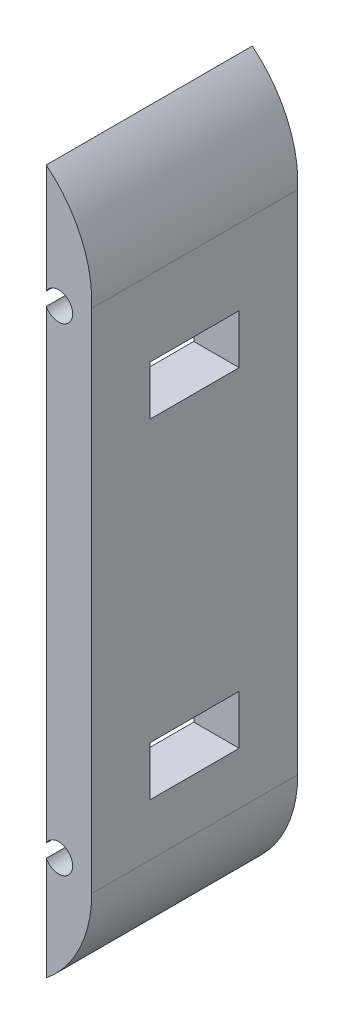
ISO-10303-21;
HEADER;
FILE_DESCRIPTION(('STEP AP214'),'2;1');
FILE_NAME('part.step','',(''),(''),'','','');
FILE_SCHEMA(('AUTOMOTIVE_DESIGN { 1 0 10303 214 1 1 1 1 }'));
ENDSEC;
DATA;
#1=APPLICATION_CONTEXT('core data for automotive mechanical design processes');
#2=APPLICATION_PROTOCOL_DEFINITION('international standard','automotive_design',2000,#1);
#3=PRODUCT_CONTEXT('',#1,'mechanical');
#4=PRODUCT('Part','Part','',(#3));
#5=PRODUCT_RELATED_PRODUCT_CATEGORY('part','',(#4));
#6=PRODUCT_DEFINITION_FORMATION('','',#4);
#7=PRODUCT_DEFINITION_CONTEXT('part definition',#1,'design');
#8=PRODUCT_DEFINITION('design','',#6,#7);
#9=PRODUCT_DEFINITION_SHAPE('','',#8);
#10=(LENGTH_UNIT() NAMED_UNIT(*) SI_UNIT(.MILLI.,.METRE.));
#11=(NAMED_UNIT(*) PLANE_ANGLE_UNIT() SI_UNIT($,.RADIAN.));
#12=(NAMED_UNIT(*) SI_UNIT($,.STERADIAN.) SOLID_ANGLE_UNIT());
#13=UNCERTAINTY_MEASURE_WITH_UNIT(LENGTH_MEASURE(1.E-05),#10,'distance_accuracy_value','');
#14=(GEOMETRIC_REPRESENTATION_CONTEXT(3) GLOBAL_UNCERTAINTY_ASSIGNED_CONTEXT((#13)) GLOBAL_UNIT_ASSIGNED_CONTEXT((#10,
#11,#12)) REPRESENTATION_CONTEXT('',''));
#15=CARTESIAN_POINT('',(0.,0.,0.));
#16=DIRECTION('',(0.,0.,1.));
#17=DIRECTION('',(1.,0.,0.));
#18=AXIS2_PLACEMENT_3D('',#15,#16,#17);
#19=CARTESIAN_POINT('',(-1.01526099399118,-27.0409833911618,25.));
#20=DIRECTION('',(0.,0.,-1.));
#21=DIRECTION('',(-1.,0.,0.));
#22=AXIS2_PLACEMENT_3D('',#19,#20,#21);
#23=CYLINDRICAL_SURFACE('',#22,1.70000000000002);
#24=CARTESIAN_POINT('',(-1.01526099399118,-27.0409833911618,0.));
#25=DIRECTION('',(0.,0.,-1.));
#26=DIRECTION('',(1.,0.,0.));
#27=AXIS2_PLACEMENT_3D('',#24,#25,#26);
#28=CIRCLE('',#27,1.70000000000002);
#29=CARTESIAN_POINT('',(-2.51526099399118,-26.2409833911617,0.));
#30=VERTEX_POINT('',#29);
#31=CARTESIAN_POINT('',(-2.51526099399118,-27.8409833911618,0.));
#32=VERTEX_POINT('',#31);
#33=EDGE_CURVE('E182',#30,#32,#28,.T.);
#34=ORIENTED_EDGE('',*,*,#33,.T.);
#35=DIRECTION('',(0.,0.,-1.));
#36=VECTOR('',#35,1.);
#37=CARTESIAN_POINT('',(-2.51526099399118,-27.8409833911618,25.));
#38=LINE('',#37,#36);
#39=CARTESIAN_POINT('',(-2.51526099399118,-27.8409833911618,25.));
#40=VERTEX_POINT('',#39);
#41=EDGE_CURVE('E258',#40,#32,#38,.T.);
#42=ORIENTED_EDGE('',*,*,#41,.F.);
#43=CARTESIAN_POINT('',(-1.01526099399118,-27.0409833911618,25.));
#44=DIRECTION('',(0.,0.,-1.));
#45=DIRECTION('',(1.,0.,0.));
#46=AXIS2_PLACEMENT_3D('',#43,#44,#45);
#47=CIRCLE('',#46,1.70000000000002);
#48=CARTESIAN_POINT('',(-2.51526099399118,-26.2409833911617,25.));
#49=VERTEX_POINT('',#48);
#50=EDGE_CURVE('E203',#49,#40,#47,.T.);
#51=ORIENTED_EDGE('',*,*,#50,.F.);
#52=DIRECTION('',(0.,0.,-1.));
#53=VECTOR('',#52,1.);
#54=CARTESIAN_POINT('',(-2.51526099399118,-26.2409833911617,25.));
#55=LINE('',#54,#53);
#56=EDGE_CURVE('E221',#49,#30,#55,.T.);
#57=ORIENTED_EDGE('',*,*,#56,.T.);
#58=EDGE_LOOP('',(#34,#42,#51,#57));
#59=FACE_BOUND('',#58,.T.);
#60=ADVANCED_FACE('F39',(#59),#23,.F.);
#61=CARTESIAN_POINT('',(-2.51526099399118,-27.8409833911618,25.));
#62=DIRECTION('',(1.,0.,0.));
#63=DIRECTION('',(0.,1.,0.));
#64=AXIS2_PLACEMENT_3D('',#61,#62,#63);
#65=PLANE('',#64);
#66=DIRECTION('',(0.,-1.,0.));
#67=VECTOR('',#66,1.);
#68=CARTESIAN_POINT('',(-2.51526099399118,-27.8409833911618,0.));
#69=LINE('',#68,#67);
#70=CARTESIAN_POINT('',(-2.51526099399119,-40.4206594472041,0.));
#71=VERTEX_POINT('',#70);
#72=EDGE_CURVE('E224',#32,#71,#69,.T.);
#73=ORIENTED_EDGE('',*,*,#72,.T.);
#74=DIRECTION('',(0.,0.,-1.));
#75=VECTOR('',#74,1.);
#76=CARTESIAN_POINT('',(-2.51526099399119,-40.4206594472041,25.));
#77=LINE('',#76,#75);
#78=CARTESIAN_POINT('',(-2.51526099399119,-40.4206594472041,25.));
#79=VERTEX_POINT('',#78);
#80=EDGE_CURVE('E255',#79,#71,#77,.T.);
#81=ORIENTED_EDGE('',*,*,#80,.F.);
#82=DIRECTION('',(0.,-1.,0.));
#83=VECTOR('',#82,1.);
#84=CARTESIAN_POINT('',(-2.51526099399118,-27.8409833911618,25.));
#85=LINE('',#84,#83);
#86=EDGE_CURVE('E206',#40,#79,#85,.T.);
#87=ORIENTED_EDGE('',*,*,#86,.F.);
#88=ORIENTED_EDGE('',*,*,#41,.T.);
#89=EDGE_LOOP('',(#73,#81,#87,#88));
#90=FACE_BOUND('',#89,.T.);
#91=ADVANCED_FACE('F297',(#90),#65,.F.);
#92=CARTESIAN_POINT('',(-12.,-28.8,25.));
#93=DIRECTION('',(0.,0.,-1.));
#94=DIRECTION('',(-1.,0.,0.));
#95=AXIS2_PLACEMENT_3D('',#92,#93,#94);
#96=CYLINDRICAL_SURFACE('',#95,15.);
#97=CARTESIAN_POINT('',(-12.,-28.8,0.));
#98=DIRECTION('',(0.,0.,1.));
#99=DIRECTION('',(-1.,0.,0.));
#100=AXIS2_PLACEMENT_3D('',#97,#98,#99);
#101=CIRCLE('',#100,15.);
#102=CARTESIAN_POINT('',(3.,-28.8,0.));
#103=VERTEX_POINT('',#102);
#104=EDGE_CURVE('E226',#71,#103,#101,.T.);
#105=ORIENTED_EDGE('',*,*,#104,.T.);
#106=DIRECTION('',(0.,0.,-1.));
#107=VECTOR('',#106,1.);
#108=CARTESIAN_POINT('',(3.,-28.8,25.));
#109=LINE('',#108,#107);
#110=CARTESIAN_POINT('',(3.,-28.8,25.));
#111=VERTEX_POINT('',#110);
#112=EDGE_CURVE('E252',#111,#103,#109,.T.);
#113=ORIENTED_EDGE('',*,*,#112,.F.);
#114=CARTESIAN_POINT('',(-12.,-28.8,25.));
#115=DIRECTION('',(0.,0.,1.));
#116=DIRECTION('',(-1.,0.,0.));
#117=AXIS2_PLACEMENT_3D('',#114,#115,#116);
#118=CIRCLE('',#117,15.);
#119=EDGE_CURVE('E209',#79,#111,#118,.T.);
#120=ORIENTED_EDGE('',*,*,#119,.F.);
#121=ORIENTED_EDGE('',*,*,#80,.T.);
#122=EDGE_LOOP('',(#105,#113,#120,#121));
#123=FACE_BOUND('',#122,.T.);
#124=ADVANCED_FACE('F302',(#123),#96,.T.);
#125=CARTESIAN_POINT('',(3.,-28.8,25.));
#126=DIRECTION('',(-1.,0.,0.));
#127=DIRECTION('',(0.,0.,1.));
#128=AXIS2_PLACEMENT_3D('',#125,#126,#127);
#129=PLANE('',#128);
#130=DIRECTION('',(0.,0.,-1.));
#131=VECTOR('',#130,1.);
#132=CARTESIAN_POINT('',(3.,17.5242639143245,7.1));
#133=LINE('',#132,#131);
#134=CARTESIAN_POINT('',(3.,17.5242639143245,17.9));
#135=VERTEX_POINT('',#134);
#136=CARTESIAN_POINT('',(3.,17.5242639143245,7.1));
#137=VERTEX_POINT('',#136);
#138=EDGE_CURVE('E168',#135,#137,#133,.T.);
#139=ORIENTED_EDGE('',*,*,#138,.F.);
#140=DIRECTION('',(0.,-1.,0.));
#141=VECTOR('',#140,1.);
#142=CARTESIAN_POINT('',(3.,17.5242639143245,17.9));
#143=LINE('',#142,#141);
#144=CARTESIAN_POINT('',(3.,23.5242639143245,17.9));
#145=VERTEX_POINT('',#144);
#146=EDGE_CURVE('E53',#145,#135,#143,.T.);
#147=ORIENTED_EDGE('',*,*,#146,.F.);
#148=DIRECTION('',(0.,0.,1.));
#149=VECTOR('',#148,1.);
#150=CARTESIAN_POINT('',(3.,23.5242639143246,7.1));
#151=LINE('',#150,#149);
#152=CARTESIAN_POINT('',(3.,23.5242639143246,7.1));
#153=VERTEX_POINT('',#152);
#154=EDGE_CURVE('E175',#153,#145,#151,.T.);
#155=ORIENTED_EDGE('',*,*,#154,.F.);
#156=DIRECTION('',(0.,1.,0.));
#157=VECTOR('',#156,1.);
#158=CARTESIAN_POINT('',(3.,17.5242639143245,7.1));
#159=LINE('',#158,#157);
#160=EDGE_CURVE('E158',#137,#153,#159,.T.);
#161=ORIENTED_EDGE('',*,*,#160,.F.);
#162=EDGE_LOOP('',(#139,#147,#155,#161));
#163=FACE_BOUND('',#162,.T.);
#164=DIRECTION('',(0.,0.,-1.));
#165=VECTOR('',#164,1.);
#166=CARTESIAN_POINT('',(3.,-22.4757360856755,7.1));
#167=LINE('',#166,#165);
#168=CARTESIAN_POINT('',(3.,-22.4757360856755,17.9));
#169=VERTEX_POINT('',#168);
#170=CARTESIAN_POINT('',(3.,-22.4757360856755,7.1));
#171=VERTEX_POINT('',#170);
#172=EDGE_CURVE('E199',#169,#171,#167,.T.);
#173=ORIENTED_EDGE('',*,*,#172,.F.);
#174=DIRECTION('',(0.,-1.,0.));
#175=VECTOR('',#174,1.);
#176=CARTESIAN_POINT('',(3.,-22.4757360856755,17.9));
#177=LINE('',#176,#175);
#178=CARTESIAN_POINT('',(3.,-16.4757360856755,17.9));
#179=VERTEX_POINT('',#178);
#180=EDGE_CURVE('E61',#179,#169,#177,.T.);
#181=ORIENTED_EDGE('',*,*,#180,.F.);
#182=DIRECTION('',(0.,0.,1.));
#183=VECTOR('',#182,1.);
#184=CARTESIAN_POINT('',(3.,-16.4757360856755,7.1));
#185=LINE('',#184,#183);
#186=CARTESIAN_POINT('',(3.,-16.4757360856755,7.1));
#187=VERTEX_POINT('',#186);
#188=EDGE_CURVE('E187',#187,#179,#185,.T.);
#189=ORIENTED_EDGE('',*,*,#188,.F.);
#190=DIRECTION('',(0.,1.,0.));
#191=VECTOR('',#190,1.);
#192=CARTESIAN_POINT('',(3.,-22.4757360856755,7.1));
#193=LINE('',#192,#191);
#194=EDGE_CURVE('E196',#171,#187,#193,.T.);
#195=ORIENTED_EDGE('',*,*,#194,.F.);
#196=EDGE_LOOP('',(#173,#181,#189,#195));
#197=FACE_BOUND('',#196,.T.);
#198=DIRECTION('',(0.,1.,0.));
#199=VECTOR('',#198,1.);
#200=CARTESIAN_POINT('',(3.,-28.8,0.));
#201=LINE('',#200,#199);
#202=CARTESIAN_POINT('',(3.,32.7,0.));
#203=VERTEX_POINT('',#202);
#204=EDGE_CURVE('E228',#103,#203,#201,.T.);
#205=ORIENTED_EDGE('',*,*,#204,.T.);
#206=DIRECTION('',(0.,0.,-1.));
#207=VECTOR('',#206,1.);
#208=CARTESIAN_POINT('',(3.,32.7,25.));
#209=LINE('',#208,#207);
#210=CARTESIAN_POINT('',(3.,32.7,25.));
#211=VERTEX_POINT('',#210);
#212=EDGE_CURVE('E249',#211,#203,#209,.T.);
#213=ORIENTED_EDGE('',*,*,#212,.F.);
#214=DIRECTION('',(0.,1.,0.));
#215=VECTOR('',#214,1.);
#216=CARTESIAN_POINT('',(3.,-28.8,25.));
#217=LINE('',#216,#215);
#218=EDGE_CURVE('E211',#111,#211,#217,.T.);
#219=ORIENTED_EDGE('',*,*,#218,.F.);
#220=ORIENTED_EDGE('',*,*,#112,.T.);
#221=EDGE_LOOP('',(#205,#213,#219,#220));
#222=FACE_BOUND('',#221,.T.);
#223=ADVANCED_FACE('F172',(#163,#197,#222),#129,.F.);
#224=CARTESIAN_POINT('',(-11.9842666270568,33.3868432494189,25.));
#225=DIRECTION('',(0.,0.,-1.));
#226=DIRECTION('',(-1.,0.,0.));
#227=AXIS2_PLACEMENT_3D('',#224,#225,#226);
#228=CYLINDRICAL_SURFACE('',#227,15.);
#229=CARTESIAN_POINT('',(-11.9842666270568,33.3868432494189,0.));
#230=DIRECTION('',(0.,0.,1.));
#231=DIRECTION('',(1.,0.,0.));
#232=AXIS2_PLACEMENT_3D('',#229,#230,#231);
#233=CIRCLE('',#232,15.);
#234=CARTESIAN_POINT('',(-2.51526099399119,45.0203264905197,0.));
#235=VERTEX_POINT('',#234);
#236=EDGE_CURVE('E230',#203,#235,#233,.T.);
#237=ORIENTED_EDGE('',*,*,#236,.T.);
#238=DIRECTION('',(0.,0.,-1.));
#239=VECTOR('',#238,1.);
#240=CARTESIAN_POINT('',(-2.51526099399119,45.0203264905197,25.));
#241=LINE('',#240,#239);
#242=CARTESIAN_POINT('',(-2.51526099399119,45.0203264905197,25.));
#243=VERTEX_POINT('',#242);
#244=EDGE_CURVE('E246',#243,#235,#241,.T.);
#245=ORIENTED_EDGE('',*,*,#244,.F.);
#246=CARTESIAN_POINT('',(-11.9842666270568,33.3868432494189,25.));
#247=DIRECTION('',(0.,0.,1.));
#248=DIRECTION('',(1.,0.,0.));
#249=AXIS2_PLACEMENT_3D('',#246,#247,#248);
#250=CIRCLE('',#249,15.);
#251=EDGE_CURVE('E213',#211,#243,#250,.T.);
#252=ORIENTED_EDGE('',*,*,#251,.F.);
#253=ORIENTED_EDGE('',*,*,#212,.T.);
#254=EDGE_LOOP('',(#237,#245,#252,#253));
#255=FACE_BOUND('',#254,.T.);
#256=ADVANCED_FACE('F329',(#255),#228,.T.);
#257=CARTESIAN_POINT('',(-2.51526099399119,35.4590166088383,25.));
#258=DIRECTION('',(1.,0.,0.));
#259=DIRECTION('',(0.,1.,0.));
#260=AXIS2_PLACEMENT_3D('',#257,#258,#259);
#261=PLANE('',#260);
#262=DIRECTION('',(0.,-1.,0.));
#263=VECTOR('',#262,1.);
#264=CARTESIAN_POINT('',(-2.51526099399119,35.4590166088383,0.));
#265=LINE('',#264,#263);
#266=CARTESIAN_POINT('',(-2.51526099399119,31.7590166088383,0.));
#267=VERTEX_POINT('',#266);
#268=EDGE_CURVE('E233',#235,#267,#265,.T.);
#269=ORIENTED_EDGE('',*,*,#268,.T.);
#270=DIRECTION('',(0.,0.,-1.));
#271=VECTOR('',#270,1.);
#272=CARTESIAN_POINT('',(-2.51526099399119,31.7590166088383,25.));
#273=LINE('',#272,#271);
#274=CARTESIAN_POINT('',(-2.51526099399119,31.7590166088383,25.));
#275=VERTEX_POINT('',#274);
#276=EDGE_CURVE('E243',#275,#267,#273,.T.);
#277=ORIENTED_EDGE('',*,*,#276,.F.);
#278=DIRECTION('',(0.,-1.,0.));
#279=VECTOR('',#278,1.);
#280=CARTESIAN_POINT('',(-2.51526099399119,35.4590166088383,25.));
#281=LINE('',#280,#279);
#282=EDGE_CURVE('E215',#243,#275,#281,.T.);
#283=ORIENTED_EDGE('',*,*,#282,.F.);
#284=ORIENTED_EDGE('',*,*,#244,.T.);
#285=EDGE_LOOP('',(#269,#277,#283,#284));
#286=FACE_BOUND('',#285,.T.);
#287=ADVANCED_FACE('F333',(#286),#261,.F.);
#288=CARTESIAN_POINT('',(-1.01526099399119,30.9590166088383,25.));
#289=DIRECTION('',(0.,0.,-1.));
#290=DIRECTION('',(-1.,0.,0.));
#291=AXIS2_PLACEMENT_3D('',#288,#289,#290);
#292=CYLINDRICAL_SURFACE('',#291,1.7);
#293=CARTESIAN_POINT('',(-1.01526099399119,30.9590166088383,0.));
#294=DIRECTION('',(0.,0.,-1.));
#295=DIRECTION('',(1.,0.,0.));
#296=AXIS2_PLACEMENT_3D('',#293,#294,#295);
#297=CIRCLE('',#296,1.7);
#298=CARTESIAN_POINT('',(-2.51526099399119,30.1590166088383,0.));
#299=VERTEX_POINT('',#298);
#300=EDGE_CURVE('E235',#267,#299,#297,.T.);
#301=ORIENTED_EDGE('',*,*,#300,.T.);
#302=DIRECTION('',(0.,0.,-1.));
#303=VECTOR('',#302,1.);
#304=CARTESIAN_POINT('',(-2.51526099399119,30.1590166088383,25.));
#305=LINE('',#304,#303);
#306=CARTESIAN_POINT('',(-2.51526099399119,30.1590166088383,25.));
#307=VERTEX_POINT('',#306);
#308=EDGE_CURVE('E240',#307,#299,#305,.T.);
#309=ORIENTED_EDGE('',*,*,#308,.F.);
#310=CARTESIAN_POINT('',(-1.01526099399119,30.9590166088383,25.));
#311=DIRECTION('',(0.,0.,-1.));
#312=DIRECTION('',(1.,0.,0.));
#313=AXIS2_PLACEMENT_3D('',#310,#311,#312);
#314=CIRCLE('',#313,1.7);
#315=EDGE_CURVE('E217',#275,#307,#314,.T.);
#316=ORIENTED_EDGE('',*,*,#315,.F.);
#317=ORIENTED_EDGE('',*,*,#276,.T.);
#318=EDGE_LOOP('',(#301,#309,#316,#317));
#319=FACE_BOUND('',#318,.T.);
#320=ADVANCED_FACE('F323',(#319),#292,.F.);
#321=CARTESIAN_POINT('',(-2.51526099399119,30.1590166088383,25.));
#322=DIRECTION('',(1.,0.,0.));
#323=DIRECTION('',(0.,1.,0.));
#324=AXIS2_PLACEMENT_3D('',#321,#322,#323);
#325=PLANE('',#324);
#326=DIRECTION('',(0.,0.,1.));
#327=VECTOR('',#326,1.);
#328=CARTESIAN_POINT('',(-2.51526099399119,23.5242639143245,25.));
#329=LINE('',#328,#327);
#330=CARTESIAN_POINT('',(-2.51526099399119,23.5242639143246,7.1));
#331=VERTEX_POINT('',#330);
#332=CARTESIAN_POINT('',(-2.51526099399119,23.5242639143245,17.9));
#333=VERTEX_POINT('',#332);
#334=EDGE_CURVE('E46',#331,#333,#329,.T.);
#335=ORIENTED_EDGE('',*,*,#334,.T.);
#336=DIRECTION('',(0.,-1.,0.));
#337=VECTOR('',#336,1.);
#338=CARTESIAN_POINT('',(-2.51526099399119,30.1590166088383,17.9));
#339=LINE('',#338,#337);
#340=CARTESIAN_POINT('',(-2.51526099399119,17.5242639143245,17.9));
#341=VERTEX_POINT('',#340);
#342=EDGE_CURVE('E11',#333,#341,#339,.T.);
#343=ORIENTED_EDGE('',*,*,#342,.T.);
#344=DIRECTION('',(0.,0.,-1.));
#345=VECTOR('',#344,1.);
#346=CARTESIAN_POINT('',(-2.51526099399119,17.5242639143245,25.));
#347=LINE('',#346,#345);
#348=CARTESIAN_POINT('',(-2.51526099399119,17.5242639143246,7.1));
#349=VERTEX_POINT('',#348);
#350=EDGE_CURVE('E273',#341,#349,#347,.T.);
#351=ORIENTED_EDGE('',*,*,#350,.T.);
#352=DIRECTION('',(0.,1.,0.));
#353=VECTOR('',#352,1.);
#354=CARTESIAN_POINT('',(-2.51526099399119,30.1590166088383,7.1));
#355=LINE('',#354,#353);
#356=EDGE_CURVE('E161',#349,#331,#355,.T.);
#357=ORIENTED_EDGE('',*,*,#356,.T.);
#358=EDGE_LOOP('',(#335,#343,#351,#357));
#359=FACE_BOUND('',#358,.T.);
#360=DIRECTION('',(0.,0.,1.));
#361=VECTOR('',#360,1.);
#362=CARTESIAN_POINT('',(-2.51526099399119,-16.4757360856755,25.));
#363=LINE('',#362,#361);
#364=CARTESIAN_POINT('',(-2.51526099399118,-16.4757360856755,7.1));
#365=VERTEX_POINT('',#364);
#366=CARTESIAN_POINT('',(-2.51526099399119,-16.4757360856755,17.9));
#367=VERTEX_POINT('',#366);
#368=EDGE_CURVE('E267',#365,#367,#363,.T.);
#369=ORIENTED_EDGE('',*,*,#368,.T.);
#370=DIRECTION('',(0.,-1.,0.));
#371=VECTOR('',#370,1.);
#372=CARTESIAN_POINT('',(-2.51526099399119,30.1590166088383,17.9));
#373=LINE('',#372,#371);
#374=CARTESIAN_POINT('',(-2.51526099399118,-22.4757360856755,17.9));
#375=VERTEX_POINT('',#374);
#376=EDGE_CURVE('E270',#367,#375,#373,.T.);
#377=ORIENTED_EDGE('',*,*,#376,.T.);
#378=DIRECTION('',(0.,0.,-1.));
#379=VECTOR('',#378,1.);
#380=CARTESIAN_POINT('',(-2.51526099399118,-22.4757360856755,25.));
#381=LINE('',#380,#379);
#382=CARTESIAN_POINT('',(-2.51526099399118,-22.4757360856755,7.1));
#383=VERTEX_POINT('',#382);
#384=EDGE_CURVE('E261',#375,#383,#381,.T.);
#385=ORIENTED_EDGE('',*,*,#384,.T.);
#386=DIRECTION('',(0.,1.,0.));
#387=VECTOR('',#386,1.);
#388=CARTESIAN_POINT('',(-2.51526099399119,30.1590166088383,7.09999999999999));
#389=LINE('',#388,#387);
#390=EDGE_CURVE('E264',#383,#365,#389,.T.);
#391=ORIENTED_EDGE('',*,*,#390,.T.);
#392=EDGE_LOOP('',(#369,#377,#385,#391));
#393=FACE_BOUND('',#392,.T.);
#394=DIRECTION('',(0.,-1.,0.));
#395=VECTOR('',#394,1.);
#396=CARTESIAN_POINT('',(-2.51526099399119,30.1590166088383,0.));
#397=LINE('',#396,#395);
#398=EDGE_CURVE('E207',#299,#30,#397,.T.);
#399=ORIENTED_EDGE('',*,*,#398,.T.);
#400=ORIENTED_EDGE('',*,*,#56,.F.);
#401=DIRECTION('',(0.,-1.,0.));
#402=VECTOR('',#401,1.);
#403=CARTESIAN_POINT('',(-2.51526099399119,30.1590166088383,25.));
#404=LINE('',#403,#402);
#405=EDGE_CURVE('E219',#307,#49,#404,.T.);
#406=ORIENTED_EDGE('',*,*,#405,.F.);
#407=ORIENTED_EDGE('',*,*,#308,.T.);
#408=EDGE_LOOP('',(#399,#400,#406,#407));
#409=FACE_BOUND('',#408,.T.);
#410=ADVANCED_FACE('F277',(#359,#393,#409),#325,.F.);
#411=CARTESIAN_POINT('',(-1.01526099399118,-27.0409833911618,25.));
#412=DIRECTION('',(0.,0.,1.));
#413=DIRECTION('',(1.,0.,0.));
#414=AXIS2_PLACEMENT_3D('',#411,#412,#413);
#415=PLANE('',#414);
#416=ORIENTED_EDGE('',*,*,#50,.T.);
#417=ORIENTED_EDGE('',*,*,#86,.T.);
#418=ORIENTED_EDGE('',*,*,#119,.T.);
#419=ORIENTED_EDGE('',*,*,#218,.T.);
#420=ORIENTED_EDGE('',*,*,#251,.T.);
#421=ORIENTED_EDGE('',*,*,#282,.T.);
#422=ORIENTED_EDGE('',*,*,#315,.T.);
#423=ORIENTED_EDGE('',*,*,#405,.T.);
#424=EDGE_LOOP('',(#416,#417,#418,#419,#420,#421,#422,#423));
#425=FACE_BOUND('',#424,.T.);
#426=ADVANCED_FACE('F317',(#425),#415,.T.);
#427=CARTESIAN_POINT('',(-1.01526099399118,-27.0409833911618,0.));
#428=DIRECTION('',(0.,0.,1.));
#429=DIRECTION('',(1.,0.,0.));
#430=AXIS2_PLACEMENT_3D('',#427,#428,#429);
#431=PLANE('',#430);
#432=ORIENTED_EDGE('',*,*,#33,.F.);
#433=ORIENTED_EDGE('',*,*,#398,.F.);
#434=ORIENTED_EDGE('',*,*,#300,.F.);
#435=ORIENTED_EDGE('',*,*,#268,.F.);
#436=ORIENTED_EDGE('',*,*,#236,.F.);
#437=ORIENTED_EDGE('',*,*,#204,.F.);
#438=ORIENTED_EDGE('',*,*,#104,.F.);
#439=ORIENTED_EDGE('',*,*,#72,.F.);
#440=EDGE_LOOP('',(#432,#433,#434,#435,#436,#437,#438,#439));
#441=FACE_BOUND('',#440,.T.);
#442=ADVANCED_FACE('F310',(#441),#431,.F.);
#443=CARTESIAN_POINT('',(-13.,-22.4757360856755,17.9));
#444=DIRECTION('',(0.,0.,1.));
#445=DIRECTION('',(1.,0.,0.));
#446=AXIS2_PLACEMENT_3D('',#443,#444,#445);
#447=PLANE('',#446);
#448=DIRECTION('',(1.,0.,0.));
#449=VECTOR('',#448,1.);
#450=CARTESIAN_POINT('',(-13.,-16.4757360856755,17.9));
#451=LINE('',#450,#449);
#452=EDGE_CURVE('E192',#367,#179,#451,.T.);
#453=ORIENTED_EDGE('',*,*,#452,.T.);
#454=ORIENTED_EDGE('',*,*,#180,.T.);
#455=DIRECTION('',(1.,0.,0.));
#456=VECTOR('',#455,1.);
#457=CARTESIAN_POINT('',(-13.,-22.4757360856755,17.9));
#458=LINE('',#457,#456);
#459=EDGE_CURVE('E185',#375,#169,#458,.T.);
#460=ORIENTED_EDGE('',*,*,#459,.F.);
#461=ORIENTED_EDGE('',*,*,#376,.F.);
#462=EDGE_LOOP('',(#453,#454,#460,#461));
#463=FACE_BOUND('',#462,.T.);
#464=ADVANCED_FACE('F355',(#463),#447,.F.);
#465=CARTESIAN_POINT('',(-13.,-16.4757360856755,7.1));
#466=DIRECTION('',(0.,1.,0.));
#467=DIRECTION('',(0.,0.,1.));
#468=AXIS2_PLACEMENT_3D('',#465,#466,#467);
#469=PLANE('',#468);
#470=DIRECTION('',(1.,0.,0.));
#471=VECTOR('',#470,1.);
#472=CARTESIAN_POINT('',(-13.,-16.4757360856755,7.1));
#473=LINE('',#472,#471);
#474=EDGE_CURVE('E190',#365,#187,#473,.T.);
#475=ORIENTED_EDGE('',*,*,#474,.T.);
#476=ORIENTED_EDGE('',*,*,#188,.T.);
#477=ORIENTED_EDGE('',*,*,#452,.F.);
#478=ORIENTED_EDGE('',*,*,#368,.F.);
#479=EDGE_LOOP('',(#475,#476,#477,#478));
#480=FACE_BOUND('',#479,.T.);
#481=ADVANCED_FACE('F358',(#480),#469,.F.);
#482=CARTESIAN_POINT('',(-13.,-22.4757360856755,7.1));
#483=DIRECTION('',(0.,0.,-1.));
#484=DIRECTION('',(0.,1.,0.));
#485=AXIS2_PLACEMENT_3D('',#482,#483,#484);
#486=PLANE('',#485);
#487=DIRECTION('',(1.,0.,0.));
#488=VECTOR('',#487,1.);
#489=CARTESIAN_POINT('',(-13.,-22.4757360856755,7.1));
#490=LINE('',#489,#488);
#491=EDGE_CURVE('E188',#383,#171,#490,.T.);
#492=ORIENTED_EDGE('',*,*,#491,.T.);
#493=ORIENTED_EDGE('',*,*,#194,.T.);
#494=ORIENTED_EDGE('',*,*,#474,.F.);
#495=ORIENTED_EDGE('',*,*,#390,.F.);
#496=EDGE_LOOP('',(#492,#493,#494,#495));
#497=FACE_BOUND('',#496,.T.);
#498=ADVANCED_FACE('F291',(#497),#486,.F.);
#499=CARTESIAN_POINT('',(-13.,-22.4757360856755,7.1));
#500=DIRECTION('',(0.,-1.,0.));
#501=DIRECTION('',(0.,0.,-1.));
#502=AXIS2_PLACEMENT_3D('',#499,#500,#501);
#503=PLANE('',#502);
#504=ORIENTED_EDGE('',*,*,#459,.T.);
#505=ORIENTED_EDGE('',*,*,#172,.T.);
#506=ORIENTED_EDGE('',*,*,#491,.F.);
#507=ORIENTED_EDGE('',*,*,#384,.F.);
#508=EDGE_LOOP('',(#504,#505,#506,#507));
#509=FACE_BOUND('',#508,.T.);
#510=ADVANCED_FACE('F284',(#509),#503,.F.);
#511=CARTESIAN_POINT('',(-13.,17.5242639143245,17.9));
#512=DIRECTION('',(0.,0.,1.));
#513=DIRECTION('',(1.,0.,0.));
#514=AXIS2_PLACEMENT_3D('',#511,#512,#513);
#515=PLANE('',#514);
#516=DIRECTION('',(1.,0.,0.));
#517=VECTOR('',#516,1.);
#518=CARTESIAN_POINT('',(-13.,23.5242639143245,17.9));
#519=LINE('',#518,#517);
#520=EDGE_CURVE('E180',#333,#145,#519,.T.);
#521=ORIENTED_EDGE('',*,*,#520,.T.);
#522=ORIENTED_EDGE('',*,*,#146,.T.);
#523=DIRECTION('',(1.,0.,0.));
#524=VECTOR('',#523,1.);
#525=CARTESIAN_POINT('',(-13.,17.5242639143245,17.9));
#526=LINE('',#525,#524);
#527=EDGE_CURVE('E165',#341,#135,#526,.T.);
#528=ORIENTED_EDGE('',*,*,#527,.F.);
#529=ORIENTED_EDGE('',*,*,#342,.F.);
#530=EDGE_LOOP('',(#521,#522,#528,#529));
#531=FACE_BOUND('',#530,.T.);
#532=ADVANCED_FACE('F282',(#531),#515,.F.);
#533=CARTESIAN_POINT('',(-13.,23.5242639143246,7.1));
#534=DIRECTION('',(0.,1.,0.));
#535=DIRECTION('',(0.,0.,1.));
#536=AXIS2_PLACEMENT_3D('',#533,#534,#535);
#537=PLANE('',#536);
#538=DIRECTION('',(1.,0.,0.));
#539=VECTOR('',#538,1.);
#540=CARTESIAN_POINT('',(-13.,23.5242639143246,7.1));
#541=LINE('',#540,#539);
#542=EDGE_CURVE('E164',#331,#153,#541,.T.);
#543=ORIENTED_EDGE('',*,*,#542,.T.);
#544=ORIENTED_EDGE('',*,*,#154,.T.);
#545=ORIENTED_EDGE('',*,*,#520,.F.);
#546=ORIENTED_EDGE('',*,*,#334,.F.);
#547=EDGE_LOOP('',(#543,#544,#545,#546));
#548=FACE_BOUND('',#547,.T.);
#549=ADVANCED_FACE('F281',(#548),#537,.F.);
#550=CARTESIAN_POINT('',(-13.,17.5242639143245,7.1));
#551=DIRECTION('',(0.,0.,-1.));
#552=DIRECTION('',(-1.,0.,0.));
#553=AXIS2_PLACEMENT_3D('',#550,#551,#552);
#554=PLANE('',#553);
#555=DIRECTION('',(1.,0.,0.));
#556=VECTOR('',#555,1.);
#557=CARTESIAN_POINT('',(-13.,17.5242639143245,7.1));
#558=LINE('',#557,#556);
#559=EDGE_CURVE('E153',#349,#137,#558,.T.);
#560=ORIENTED_EDGE('',*,*,#559,.T.);
#561=ORIENTED_EDGE('',*,*,#160,.T.);
#562=ORIENTED_EDGE('',*,*,#542,.F.);
#563=ORIENTED_EDGE('',*,*,#356,.F.);
#564=EDGE_LOOP('',(#560,#561,#562,#563));
#565=FACE_BOUND('',#564,.T.);
#566=ADVANCED_FACE('F155',(#565),#554,.F.);
#567=CARTESIAN_POINT('',(-13.,17.5242639143245,7.1));
#568=DIRECTION('',(0.,-1.,0.));
#569=DIRECTION('',(0.,0.,-1.));
#570=AXIS2_PLACEMENT_3D('',#567,#568,#569);
#571=PLANE('',#570);
#572=ORIENTED_EDGE('',*,*,#527,.T.);
#573=ORIENTED_EDGE('',*,*,#138,.T.);
#574=ORIENTED_EDGE('',*,*,#559,.F.);
#575=ORIENTED_EDGE('',*,*,#350,.F.);
#576=EDGE_LOOP('',(#572,#573,#574,#575));
#577=FACE_BOUND('',#576,.T.);
#578=ADVANCED_FACE('F169',(#577),#571,.F.);
#579=CLOSED_SHELL('',(#60,#91,#124,#223,#256,#287,#320,#410,#426,#442,#464,#481,#498,#510,#532,
#549,#566,#578));
#580=MANIFOLD_SOLID_BREP('B2',#579);
#581=ADVANCED_BREP_SHAPE_REPRESENTATION('',(#18,#580),#14);
#582=SHAPE_DEFINITION_REPRESENTATION(#9,#581);
ENDSEC;
END-ISO-10303-21;
